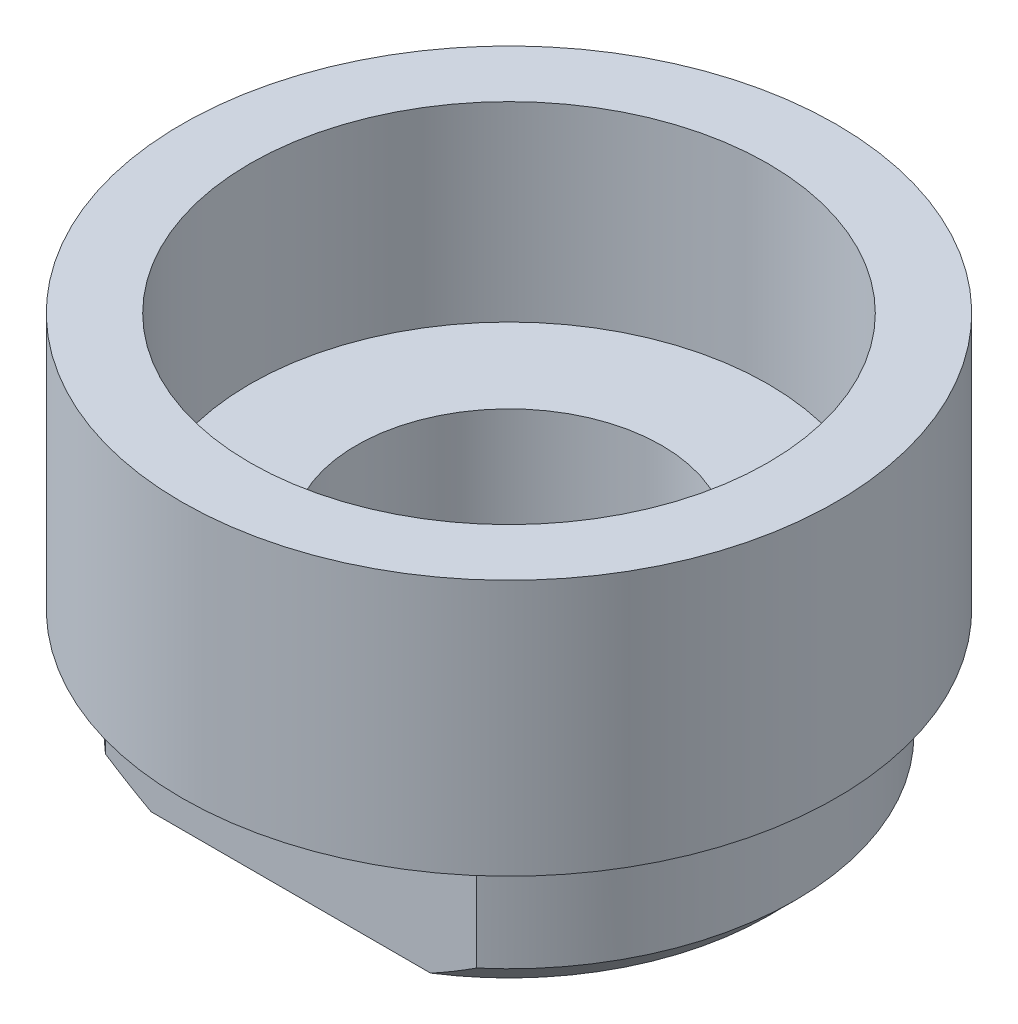
ISO-10303-21;
HEADER;
FILE_DESCRIPTION(('STEP AP214'),'2;1');
FILE_NAME('part.step','',(''),(''),'','','');
FILE_SCHEMA(('AUTOMOTIVE_DESIGN { 1 0 10303 214 1 1 1 1 }'));
ENDSEC;
DATA;
#1=APPLICATION_CONTEXT('core data for automotive mechanical design processes');
#2=APPLICATION_PROTOCOL_DEFINITION('international standard','automotive_design',2000,#1);
#3=PRODUCT_CONTEXT('',#1,'mechanical');
#4=PRODUCT('Part','Part','',(#3));
#5=PRODUCT_RELATED_PRODUCT_CATEGORY('part','',(#4));
#6=PRODUCT_DEFINITION_FORMATION('','',#4);
#7=PRODUCT_DEFINITION_CONTEXT('part definition',#1,'design');
#8=PRODUCT_DEFINITION('design','',#6,#7);
#9=PRODUCT_DEFINITION_SHAPE('','',#8);
#10=(LENGTH_UNIT() NAMED_UNIT(*) SI_UNIT(.MILLI.,.METRE.));
#11=(NAMED_UNIT(*) PLANE_ANGLE_UNIT() SI_UNIT($,.RADIAN.));
#12=(NAMED_UNIT(*) SI_UNIT($,.STERADIAN.) SOLID_ANGLE_UNIT());
#13=UNCERTAINTY_MEASURE_WITH_UNIT(LENGTH_MEASURE(1.E-05),#10,'distance_accuracy_value','');
#14=(GEOMETRIC_REPRESENTATION_CONTEXT(3) GLOBAL_UNCERTAINTY_ASSIGNED_CONTEXT((#13)) GLOBAL_UNIT_ASSIGNED_CONTEXT((#10,
#11,#12)) REPRESENTATION_CONTEXT('',''));
#15=CARTESIAN_POINT('',(0.,0.,0.));
#16=DIRECTION('',(0.,0.,1.));
#17=DIRECTION('',(1.,0.,0.));
#18=AXIS2_PLACEMENT_3D('',#15,#16,#17);
#19=CARTESIAN_POINT('',(0.,0.5,0.));
#20=DIRECTION('',(0.,1.,0.));
#21=DIRECTION('',(0.,0.,1.));
#22=AXIS2_PLACEMENT_3D('',#19,#20,#21);
#23=TOROIDAL_SURFACE('',#22,3.3,0.5);
#24=CARTESIAN_POINT('',(0.,0.,0.));
#25=DIRECTION('',(0.,-1.,0.));
#26=DIRECTION('',(0.,0.,1.));
#27=AXIS2_PLACEMENT_3D('',#24,#25,#26);
#28=CIRCLE('',#27,3.3);
#29=CARTESIAN_POINT('',(0.,0.,3.3));
#30=VERTEX_POINT('',#29);
#31=CARTESIAN_POINT('',(0.,0.,-3.3));
#32=VERTEX_POINT('',#31);
#33=EDGE_CURVE('E80',#30,#32,#28,.T.);
#34=ORIENTED_EDGE('',*,*,#33,.T.);
#35=CARTESIAN_POINT('',(0.,0.,0.));
#36=DIRECTION('',(0.,-1.,0.));
#37=DIRECTION('',(0.,0.,-1.));
#38=AXIS2_PLACEMENT_3D('',#35,#36,#37);
#39=CIRCLE('',#38,3.3);
#40=EDGE_CURVE('E77',#32,#30,#39,.T.);
#41=ORIENTED_EDGE('',*,*,#40,.T.);
#42=EDGE_LOOP('',(#34,#41));
#43=FACE_BOUND('',#42,.T.);
#44=CARTESIAN_POINT('',(0.,0.5,0.));
#45=DIRECTION('',(0.,1.,0.));
#46=DIRECTION('',(0.,0.,1.));
#47=AXIS2_PLACEMENT_3D('',#44,#45,#46);
#48=CIRCLE('',#47,2.8);
#49=CARTESIAN_POINT('',(0.,0.5,2.8));
#50=VERTEX_POINT('',#49);
#51=EDGE_CURVE('E193',#50,#50,#48,.T.);
#52=ORIENTED_EDGE('',*,*,#51,.T.);
#53=EDGE_LOOP('',(#52));
#54=FACE_BOUND('',#53,.T.);
#55=ADVANCED_FACE('F17',(#43,#54),#23,.T.);
#56=CARTESIAN_POINT('',(0.,-6.3,0.));
#57=DIRECTION('',(0.,1.,0.));
#58=DIRECTION('',(0.,0.,1.));
#59=AXIS2_PLACEMENT_3D('',#56,#57,#58);
#60=CYLINDRICAL_SURFACE('',#59,2.8);
#61=CARTESIAN_POINT('',(0.,3.7,0.));
#62=DIRECTION('',(0.,1.,0.));
#63=DIRECTION('',(0.,0.,1.));
#64=AXIS2_PLACEMENT_3D('',#61,#62,#63);
#65=CIRCLE('',#64,2.8);
#66=CARTESIAN_POINT('',(0.,3.7,2.8));
#67=VERTEX_POINT('',#66);
#68=EDGE_CURVE('E163',#67,#67,#65,.F.);
#69=ORIENTED_EDGE('',*,*,#68,.F.);
#70=EDGE_LOOP('',(#69));
#71=FACE_BOUND('',#70,.T.);
#72=ORIENTED_EDGE('',*,*,#51,.F.);
#73=EDGE_LOOP('',(#72));
#74=FACE_BOUND('',#73,.T.);
#75=ADVANCED_FACE('F202',(#71,#74),#60,.F.);
#76=CARTESIAN_POINT('',(-4.99999999999997,2.2,-4.00000000000004));
#77=DIRECTION('',(0.,0.,1.));
#78=DIRECTION('',(1.,0.,0.));
#79=AXIS2_PLACEMENT_3D('',#76,#77,#78);
#80=PLANE('',#79);
#81=CARTESIAN_POINT('',(2.56173769145884,6.12305345315534E-11,-4.00000000001156));
#82=CARTESIAN_POINT('',(2.63338731416227,0.038646313991679,-4.00000000000416));
#83=CARTESIAN_POINT('',(2.70455632198685,0.0781735779961884,-4.00000000000111));
#84=CARTESIAN_POINT('',(2.84597070902441,0.158784380345049,-3.99999999999886));
#85=CARTESIAN_POINT('',(2.91621644501601,0.199867292210686,-3.99999999999966));
#86=CARTESIAN_POINT('',(3.05587457078868,0.283412284392702,-4.0000000000003));
#87=CARTESIAN_POINT('',(3.1252870118652,0.325874279213936,-4.00000000000014));
#88=CARTESIAN_POINT('',(3.26337308740294,0.412044348550766,-3.99999999999982));
#89=CARTESIAN_POINT('',(3.33204641646155,0.455752912833128,-3.99999999999966));
#90=CARTESIAN_POINT('',(3.40036762714335,0.500000000074132,-3.99999999999998));
#91=B_SPLINE_CURVE_WITH_KNOTS('',3,(#81,#82,#83,#84,#85,#86,#87,#88,#89,#90),.UNSPECIFIED.,.F.,
.F.,(4,2,2,2,4),(0.,0.244209884421804,0.488322447148764,0.732419905092,0.976614625214236),.UNSPECIFIED.);
#92=CARTESIAN_POINT('',(2.56173769144339,5.95218319077162E-11,-3.99999999999998));
#93=VERTEX_POINT('',#92);
#94=CARTESIAN_POINT('',(3.40036762718389,0.500000000050196,-3.99999999999998));
#95=VERTEX_POINT('',#94);
#96=EDGE_CURVE('E136',#93,#95,#91,.T.);
#97=ORIENTED_EDGE('',*,*,#96,.F.);
#98=DIRECTION('',(1.,0.,0.));
#99=VECTOR('',#98,1.);
#100=CARTESIAN_POINT('',(0.,0.,-3.99999999999998));
#101=LINE('',#100,#99);
#102=CARTESIAN_POINT('',(-2.56173769144347,5.95842819528514E-11,-4.));
#103=VERTEX_POINT('',#102);
#104=EDGE_CURVE('E88',#93,#103,#101,.F.);
#105=ORIENTED_EDGE('',*,*,#104,.T.);
#106=CARTESIAN_POINT('',(-3.40036762714453,0.500000000060686,-4.00000000002186));
#107=CARTESIAN_POINT('',(-3.33204641645915,0.455752912826316,-4.00000000000791));
#108=CARTESIAN_POINT('',(-3.26337308739926,0.412044348547009,-4.00000000000215));
#109=CARTESIAN_POINT('',(-3.12528701186109,0.325874279212906,-3.9999999999979));
#110=CARTESIAN_POINT('',(-3.05587457078543,0.283412284391342,-3.99999999999942));
#111=CARTESIAN_POINT('',(-2.9162164450141,0.199867292209025,-4.00000000000063));
#112=CARTESIAN_POINT('',(-2.84597070902299,0.158784380343415,-4.00000000000032));
#113=CARTESIAN_POINT('',(-2.70455632198549,0.0781735779963016,-3.99999999999972));
#114=CARTESIAN_POINT('',(-2.63338731416048,0.0386463139935117,-3.99999999999941));
#115=CARTESIAN_POINT('',(-2.56173769145583,6.62647020588381E-11,-4.00000000000002));
#116=B_SPLINE_CURVE_WITH_KNOTS('',3,(#106,#107,#108,#109,#110,#111,#112,#113,#114,#115),
.UNSPECIFIED.,.F.,.F.,(4,2,2,2,4),(0.,0.244194720120575,0.488292178062196,0.732404740787803,
0.976614625208201),.UNSPECIFIED.);
#117=CARTESIAN_POINT('',(-3.40036762718383,0.500000000050196,-4.00000000000002));
#118=VERTEX_POINT('',#117);
#119=EDGE_CURVE('E158',#118,#103,#116,.T.);
#120=ORIENTED_EDGE('',*,*,#119,.F.);
#121=DIRECTION('',(0.,1.,0.));
#122=VECTOR('',#121,1.);
#123=CARTESIAN_POINT('',(-3.40036762718383,2.2,-4.00000000000002));
#124=LINE('',#123,#122);
#125=CARTESIAN_POINT('',(-3.40036762718383,2.2,-4.00000000000002));
#126=VERTEX_POINT('',#125);
#127=EDGE_CURVE('E71',#126,#118,#124,.F.);
#128=ORIENTED_EDGE('',*,*,#127,.F.);
#129=DIRECTION('',(1.,0.,0.));
#130=VECTOR('',#129,1.);
#131=CARTESIAN_POINT('',(-4.99999999999997,2.2,-4.00000000000002));
#132=LINE('',#131,#130);
#133=CARTESIAN_POINT('',(3.40036762718386,2.2,-4.));
#134=VERTEX_POINT('',#133);
#135=EDGE_CURVE('E176',#126,#134,#132,.T.);
#136=ORIENTED_EDGE('',*,*,#135,.T.);
#137=DIRECTION('',(0.,1.,0.));
#138=VECTOR('',#137,1.);
#139=CARTESIAN_POINT('',(3.40036762718389,2.2,-3.99999999999998));
#140=LINE('',#139,#138);
#141=EDGE_CURVE('E84',#95,#134,#140,.T.);
#142=ORIENTED_EDGE('',*,*,#141,.F.);
#143=EDGE_LOOP('',(#97,#105,#120,#128,#136,#142));
#144=FACE_BOUND('',#143,.T.);
#145=ADVANCED_FACE('F108',(#144),#80,.F.);
#146=CARTESIAN_POINT('',(0.,0.,0.));
#147=DIRECTION('',(0.,1.,0.));
#148=DIRECTION('',(0.,0.,1.));
#149=AXIS2_PLACEMENT_3D('',#146,#147,#148);
#150=PLANE('',#149);
#151=CARTESIAN_POINT('',(0.,5.26800825184637E-11,0.));
#152=DIRECTION('',(0.,1.,0.));
#153=DIRECTION('',(0.,0.,1.));
#154=AXIS2_PLACEMENT_3D('',#151,#152,#153);
#155=CIRCLE('',#154,4.74999999996806);
#156=CARTESIAN_POINT('',(2.56173769138183,2.63400412592318E-11,4.));
#157=VERTEX_POINT('',#156);
#158=EDGE_CURVE('E135',#157,#93,#155,.T.);
#159=ORIENTED_EDGE('',*,*,#158,.F.);
#160=DIRECTION('',(-1.,0.,0.));
#161=VECTOR('',#160,1.);
#162=CARTESIAN_POINT('',(5.,0.,4.));
#163=LINE('',#162,#161);
#164=CARTESIAN_POINT('',(-2.56173769139452,3.31817906484844E-11,4.));
#165=VERTEX_POINT('',#164);
#166=EDGE_CURVE('E165',#157,#165,#163,.T.);
#167=ORIENTED_EDGE('',*,*,#166,.T.);
#168=CARTESIAN_POINT('',(0.,5.26800825184637E-11,0.));
#169=DIRECTION('',(0.,1.,0.));
#170=DIRECTION('',(0.,0.,1.));
#171=AXIS2_PLACEMENT_3D('',#168,#169,#170);
#172=CIRCLE('',#171,4.74999999996806);
#173=EDGE_CURVE('E182',#103,#165,#172,.T.);
#174=ORIENTED_EDGE('',*,*,#173,.F.);
#175=ORIENTED_EDGE('',*,*,#104,.F.);
#176=EDGE_LOOP('',(#159,#167,#174,#175));
#177=FACE_BOUND('',#176,.T.);
#178=ORIENTED_EDGE('',*,*,#33,.F.);
#179=ORIENTED_EDGE('',*,*,#40,.F.);
#180=EDGE_LOOP('',(#178,#179));
#181=FACE_BOUND('',#180,.T.);
#182=ADVANCED_FACE('F87',(#177,#181),#150,.F.);
#183=CARTESIAN_POINT('',(5.,2.2,4.));
#184=DIRECTION('',(0.,0.,-1.));
#185=DIRECTION('',(-1.,0.,0.));
#186=AXIS2_PLACEMENT_3D('',#183,#184,#185);
#187=PLANE('',#186);
#188=CARTESIAN_POINT('',(3.40036762714332,0.500000000074132,4.));
#189=CARTESIAN_POINT('',(3.33204641646157,0.455752912832972,4.));
#190=CARTESIAN_POINT('',(3.2633730874029,0.412044348550666,4.));
#191=CARTESIAN_POINT('',(3.12528701186505,0.325874279213961,4.));
#192=CARTESIAN_POINT('',(3.05587457078849,0.283412284392793,4.));
#193=CARTESIAN_POINT('',(2.91621644501593,0.199867292210473,4.));
#194=CARTESIAN_POINT('',(2.84597070902451,0.158784380344463,4.));
#195=CARTESIAN_POINT('',(2.7045563219863,0.0781735779965485,4.));
#196=CARTESIAN_POINT('',(2.63338731416093,0.0386463139933577,4.));
#197=CARTESIAN_POINT('',(2.56173769145563,6.61415366920437E-11,4.));
#198=B_SPLINE_CURVE_WITH_KNOTS('',3,(#188,#189,#190,#191,#192,#193,#194,#195,#196,#197),
.UNSPECIFIED.,.F.,.F.,(4,2,2,2,4),(0.,0.244194720122317,0.488292178065575,0.73240474079265,
0.976614625214634),.UNSPECIFIED.);
#199=CARTESIAN_POINT('',(3.40036762718386,0.500000000050196,4.));
#200=VERTEX_POINT('',#199);
#201=EDGE_CURVE('E129',#200,#157,#198,.T.);
#202=ORIENTED_EDGE('',*,*,#201,.F.);
#203=DIRECTION('',(0.,1.,0.));
#204=VECTOR('',#203,1.);
#205=CARTESIAN_POINT('',(3.40036762718386,2.2,4.));
#206=LINE('',#205,#204);
#207=CARTESIAN_POINT('',(3.40036762718386,2.2,4.));
#208=VERTEX_POINT('',#207);
#209=EDGE_CURVE('E169',#208,#200,#206,.F.);
#210=ORIENTED_EDGE('',*,*,#209,.F.);
#211=DIRECTION('',(1.,0.,0.));
#212=VECTOR('',#211,1.);
#213=CARTESIAN_POINT('',(5.,2.2,4.));
#214=LINE('',#213,#212);
#215=CARTESIAN_POINT('',(-3.40036762718386,2.2,4.));
#216=VERTEX_POINT('',#215);
#217=EDGE_CURVE('E179',#208,#216,#214,.F.);
#218=ORIENTED_EDGE('',*,*,#217,.T.);
#219=DIRECTION('',(0.,1.,0.));
#220=VECTOR('',#219,1.);
#221=CARTESIAN_POINT('',(-3.40036762718386,2.2,4.));
#222=LINE('',#221,#220);
#223=CARTESIAN_POINT('',(-3.40036762718386,0.500000000050195,4.));
#224=VERTEX_POINT('',#223);
#225=EDGE_CURVE('E38',#224,#216,#222,.T.);
#226=ORIENTED_EDGE('',*,*,#225,.F.);
#227=CARTESIAN_POINT('',(-2.56173769145881,6.12305345315534E-11,4.00000000001158));
#228=CARTESIAN_POINT('',(-2.63338731416224,0.0386463139916783,4.00000000000418));
#229=CARTESIAN_POINT('',(-2.70455632198682,0.0781735779961876,4.00000000000113));
#230=CARTESIAN_POINT('',(-2.84597070902438,0.158784380345048,3.99999999999888));
#231=CARTESIAN_POINT('',(-2.91621644501598,0.199867292210686,3.99999999999968));
#232=CARTESIAN_POINT('',(-3.05587457078865,0.283412284392701,4.00000000000032));
#233=CARTESIAN_POINT('',(-3.12528701186517,0.325874279213936,4.00000000000016));
#234=CARTESIAN_POINT('',(-3.26337308740291,0.412044348550765,3.99999999999984));
#235=CARTESIAN_POINT('',(-3.33204641646152,0.455752912833127,3.99999999999968));
#236=CARTESIAN_POINT('',(-3.40036762714332,0.500000000074132,4.));
#237=B_SPLINE_CURVE_WITH_KNOTS('',3,(#227,#228,#229,#230,#231,#232,#233,#234,#235,#236),
.UNSPECIFIED.,.F.,.F.,(4,2,2,2,4),(0.,0.244209884421803,0.488322447148765,0.732419905092001,
0.976614625214236),.UNSPECIFIED.);
#238=EDGE_CURVE('E121',#165,#224,#237,.T.);
#239=ORIENTED_EDGE('',*,*,#238,.F.);
#240=ORIENTED_EDGE('',*,*,#166,.F.);
#241=EDGE_LOOP('',(#202,#210,#218,#226,#239,#240));
#242=FACE_BOUND('',#241,.T.);
#243=ADVANCED_FACE('F107',(#242),#187,.F.);
#244=CARTESIAN_POINT('',(0.,3.7,0.));
#245=DIRECTION('',(0.,1.,0.));
#246=DIRECTION('',(0.,0.,1.));
#247=AXIS2_PLACEMENT_3D('',#244,#245,#246);
#248=PLANE('',#247);
#249=CARTESIAN_POINT('',(0.,3.7,0.));
#250=DIRECTION('',(0.,1.,0.));
#251=DIRECTION('',(0.,0.,1.));
#252=AXIS2_PLACEMENT_3D('',#249,#250,#251);
#253=CIRCLE('',#252,4.75);
#254=CARTESIAN_POINT('',(0.,3.7,4.75));
#255=VERTEX_POINT('',#254);
#256=EDGE_CURVE('E181',#255,#255,#253,.T.);
#257=ORIENTED_EDGE('',*,*,#256,.T.);
#258=EDGE_LOOP('',(#257));
#259=FACE_BOUND('',#258,.T.);
#260=ORIENTED_EDGE('',*,*,#68,.T.);
#261=EDGE_LOOP('',(#260));
#262=FACE_BOUND('',#261,.T.);
#263=ADVANCED_FACE('F116',(#259,#262),#248,.T.);
#264=CARTESIAN_POINT('',(0.,0.499999999976242,0.));
#265=DIRECTION('',(0.,1.,0.));
#266=DIRECTION('',(0.,0.,1.));
#267=AXIS2_PLACEMENT_3D('',#264,#265,#266);
#268=CONICAL_SURFACE('',#267,5.24999999987585,0.785398163381683);
#269=ORIENTED_EDGE('',*,*,#201,.T.);
#270=ORIENTED_EDGE('',*,*,#158,.T.);
#271=ORIENTED_EDGE('',*,*,#96,.T.);
#272=CARTESIAN_POINT('',(0.,0.500000000000004,0.));
#273=DIRECTION('',(0.,-1.,0.));
#274=DIRECTION('',(0.,0.,-1.));
#275=AXIS2_PLACEMENT_3D('',#272,#273,#274);
#276=CIRCLE('',#275,5.25);
#277=EDGE_CURVE('E187',#200,#95,#276,.F.);
#278=ORIENTED_EDGE('',*,*,#277,.F.);
#279=EDGE_LOOP('',(#269,#270,#271,#278));
#280=FACE_BOUND('',#279,.T.);
#281=ADVANCED_FACE('F141',(#280),#268,.T.);
#282=CARTESIAN_POINT('',(-4.99999999999997,2.2,-4.00000000000004));
#283=DIRECTION('',(0.,1.,0.));
#284=DIRECTION('',(0.,0.,1.));
#285=AXIS2_PLACEMENT_3D('',#282,#283,#284);
#286=PLANE('',#285);
#287=CARTESIAN_POINT('',(0.,2.2,0.));
#288=DIRECTION('',(0.,-1.,0.));
#289=DIRECTION('',(0.,0.,-1.));
#290=AXIS2_PLACEMENT_3D('',#287,#288,#289);
#291=CIRCLE('',#290,5.25);
#292=EDGE_CURVE('E186',#134,#126,#291,.F.);
#293=ORIENTED_EDGE('',*,*,#292,.F.);
#294=ORIENTED_EDGE('',*,*,#135,.F.);
#295=EDGE_LOOP('',(#293,#294));
#296=FACE_BOUND('',#295,.T.);
#297=ADVANCED_FACE('F145',(#296),#286,.F.);
#298=CARTESIAN_POINT('',(0.,0.499999999976242,0.));
#299=DIRECTION('',(0.,1.,0.));
#300=DIRECTION('',(0.,0.,1.));
#301=AXIS2_PLACEMENT_3D('',#298,#299,#300);
#302=CONICAL_SURFACE('',#301,5.24999999987585,0.785398163381683);
#303=ORIENTED_EDGE('',*,*,#119,.T.);
#304=ORIENTED_EDGE('',*,*,#173,.T.);
#305=ORIENTED_EDGE('',*,*,#238,.T.);
#306=CARTESIAN_POINT('',(0.,0.500000000000004,0.));
#307=DIRECTION('',(0.,-1.,0.));
#308=DIRECTION('',(0.,0.,-1.));
#309=AXIS2_PLACEMENT_3D('',#306,#307,#308);
#310=CIRCLE('',#309,5.25);
#311=EDGE_CURVE('E183',#118,#224,#310,.F.);
#312=ORIENTED_EDGE('',*,*,#311,.F.);
#313=EDGE_LOOP('',(#303,#304,#305,#312));
#314=FACE_BOUND('',#313,.T.);
#315=ADVANCED_FACE('F149',(#314),#302,.T.);
#316=CARTESIAN_POINT('',(5.,2.2,4.));
#317=DIRECTION('',(0.,1.,0.));
#318=DIRECTION('',(0.,0.,1.));
#319=AXIS2_PLACEMENT_3D('',#316,#317,#318);
#320=PLANE('',#319);
#321=CARTESIAN_POINT('',(0.,2.2,0.));
#322=DIRECTION('',(0.,-1.,0.));
#323=DIRECTION('',(0.,0.,-1.));
#324=AXIS2_PLACEMENT_3D('',#321,#322,#323);
#325=CIRCLE('',#324,5.25);
#326=EDGE_CURVE('E185',#216,#208,#325,.F.);
#327=ORIENTED_EDGE('',*,*,#326,.F.);
#328=ORIENTED_EDGE('',*,*,#217,.F.);
#329=EDGE_LOOP('',(#327,#328));
#330=FACE_BOUND('',#329,.T.);
#331=ADVANCED_FACE('F154',(#330),#320,.F.);
#332=CARTESIAN_POINT('',(0.,3.7,0.));
#333=DIRECTION('',(0.,1.,0.));
#334=DIRECTION('',(0.,0.,1.));
#335=AXIS2_PLACEMENT_3D('',#332,#333,#334);
#336=CYLINDRICAL_SURFACE('',#335,4.75);
#337=CARTESIAN_POINT('',(0.,7.2,0.));
#338=DIRECTION('',(0.,1.,0.));
#339=DIRECTION('',(0.,0.,1.));
#340=AXIS2_PLACEMENT_3D('',#337,#338,#339);
#341=CIRCLE('',#340,4.75);
#342=CARTESIAN_POINT('',(0.,7.2,4.75));
#343=VERTEX_POINT('',#342);
#344=EDGE_CURVE('E234',#343,#343,#341,.F.);
#345=ORIENTED_EDGE('',*,*,#344,.F.);
#346=EDGE_LOOP('',(#345));
#347=FACE_BOUND('',#346,.T.);
#348=ORIENTED_EDGE('',*,*,#256,.F.);
#349=EDGE_LOOP('',(#348));
#350=FACE_BOUND('',#349,.T.);
#351=ADVANCED_FACE('F247',(#347,#350),#336,.F.);
#352=CARTESIAN_POINT('',(0.,2.5,0.));
#353=DIRECTION('',(0.,-1.,0.));
#354=DIRECTION('',(0.,0.,-1.));
#355=AXIS2_PLACEMENT_3D('',#352,#353,#354);
#356=CYLINDRICAL_SURFACE('',#355,5.25);
#357=CARTESIAN_POINT('',(0.,2.5,0.));
#358=DIRECTION('',(0.,-1.,0.));
#359=DIRECTION('',(0.,0.,-1.));
#360=AXIS2_PLACEMENT_3D('',#357,#358,#359);
#361=CIRCLE('',#360,5.25);
#362=CARTESIAN_POINT('',(0.,2.5,-5.25));
#363=VERTEX_POINT('',#362);
#364=EDGE_CURVE('E231',#363,#363,#361,.F.);
#365=ORIENTED_EDGE('',*,*,#364,.F.);
#366=EDGE_LOOP('',(#365));
#367=FACE_BOUND('',#366,.T.);
#368=ORIENTED_EDGE('',*,*,#225,.T.);
#369=ORIENTED_EDGE('',*,*,#326,.T.);
#370=ORIENTED_EDGE('',*,*,#209,.T.);
#371=ORIENTED_EDGE('',*,*,#277,.T.);
#372=ORIENTED_EDGE('',*,*,#141,.T.);
#373=ORIENTED_EDGE('',*,*,#292,.T.);
#374=ORIENTED_EDGE('',*,*,#127,.T.);
#375=ORIENTED_EDGE('',*,*,#311,.T.);
#376=EDGE_LOOP('',(#368,#369,#370,#371,#372,#373,#374,#375));
#377=FACE_BOUND('',#376,.T.);
#378=ADVANCED_FACE('F245',(#367,#377),#356,.T.);
#379=CARTESIAN_POINT('',(0.,7.2,0.));
#380=DIRECTION('',(0.,1.,0.));
#381=DIRECTION('',(0.,0.,1.));
#382=AXIS2_PLACEMENT_3D('',#379,#380,#381);
#383=PLANE('',#382);
#384=CARTESIAN_POINT('',(0.,7.2,0.));
#385=DIRECTION('',(0.,-1.,0.));
#386=DIRECTION('',(0.,0.,-1.));
#387=AXIS2_PLACEMENT_3D('',#384,#385,#386);
#388=CIRCLE('',#387,6.00000000000001);
#389=CARTESIAN_POINT('',(0.,7.2,-6.00000000000001));
#390=VERTEX_POINT('',#389);
#391=EDGE_CURVE('E29',#390,#390,#388,.T.);
#392=ORIENTED_EDGE('',*,*,#391,.F.);
#393=EDGE_LOOP('',(#392));
#394=FACE_BOUND('',#393,.T.);
#395=ORIENTED_EDGE('',*,*,#344,.T.);
#396=EDGE_LOOP('',(#395));
#397=FACE_BOUND('',#396,.T.);
#398=ADVANCED_FACE('F224',(#394,#397),#383,.T.);
#399=CARTESIAN_POINT('',(0.,2.5,0.));
#400=DIRECTION('',(0.,-1.,0.));
#401=DIRECTION('',(0.,0.,-1.));
#402=AXIS2_PLACEMENT_3D('',#399,#400,#401);
#403=PLANE('',#402);
#404=CARTESIAN_POINT('',(0.,2.5,0.));
#405=DIRECTION('',(0.,-1.,0.));
#406=DIRECTION('',(0.,0.,-1.));
#407=AXIS2_PLACEMENT_3D('',#404,#405,#406);
#408=CIRCLE('',#407,6.00000000000001);
#409=CARTESIAN_POINT('',(0.,2.5,-6.00000000000001));
#410=VERTEX_POINT('',#409);
#411=EDGE_CURVE('E11',#410,#410,#408,.F.);
#412=ORIENTED_EDGE('',*,*,#411,.F.);
#413=EDGE_LOOP('',(#412));
#414=FACE_BOUND('',#413,.T.);
#415=ORIENTED_EDGE('',*,*,#364,.T.);
#416=EDGE_LOOP('',(#415));
#417=FACE_BOUND('',#416,.T.);
#418=ADVANCED_FACE('F219',(#414,#417),#403,.T.);
#419=CARTESIAN_POINT('',(0.,7.2,0.));
#420=DIRECTION('',(0.,-1.,0.));
#421=DIRECTION('',(0.,0.,-1.));
#422=AXIS2_PLACEMENT_3D('',#419,#420,#421);
#423=CYLINDRICAL_SURFACE('',#422,6.00000000000001);
#424=ORIENTED_EDGE('',*,*,#411,.T.);
#425=EDGE_LOOP('',(#424));
#426=FACE_BOUND('',#425,.T.);
#427=ORIENTED_EDGE('',*,*,#391,.T.);
#428=EDGE_LOOP('',(#427));
#429=FACE_BOUND('',#428,.T.);
#430=ADVANCED_FACE('F19',(#426,#429),#423,.T.);
#431=CLOSED_SHELL('',(#55,#75,#145,#182,#243,#263,#281,#297,#315,#331,#351,#378,#398,#418,#430));
#432=MANIFOLD_SOLID_BREP('B1',#431);
#433=ADVANCED_BREP_SHAPE_REPRESENTATION('',(#18,#432),#14);
#434=SHAPE_DEFINITION_REPRESENTATION(#9,#433);
ENDSEC;
END-ISO-10303-21;
